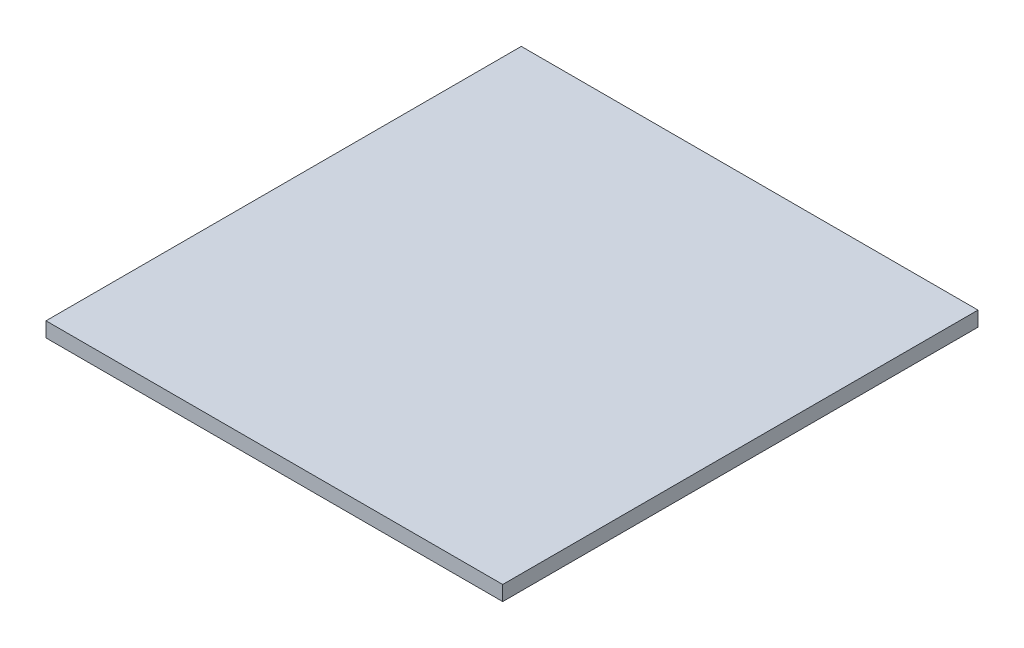
ISO-10303-21;
HEADER;
FILE_DESCRIPTION(('STEP AP214'),'2;1');
FILE_NAME('part.step','',(''),(''),'','','');
FILE_SCHEMA(('AUTOMOTIVE_DESIGN { 1 0 10303 214 1 1 1 1 }'));
ENDSEC;
DATA;
#1=APPLICATION_CONTEXT('core data for automotive mechanical design processes');
#2=APPLICATION_PROTOCOL_DEFINITION('international standard','automotive_design',2000,#1);
#3=PRODUCT_CONTEXT('',#1,'mechanical');
#4=PRODUCT('Part','Part','',(#3));
#5=PRODUCT_RELATED_PRODUCT_CATEGORY('part','',(#4));
#6=PRODUCT_DEFINITION_FORMATION('','',#4);
#7=PRODUCT_DEFINITION_CONTEXT('part definition',#1,'design');
#8=PRODUCT_DEFINITION('design','',#6,#7);
#9=PRODUCT_DEFINITION_SHAPE('','',#8);
#10=(LENGTH_UNIT() NAMED_UNIT(*) SI_UNIT(.MILLI.,.METRE.));
#11=(NAMED_UNIT(*) PLANE_ANGLE_UNIT() SI_UNIT($,.RADIAN.));
#12=(NAMED_UNIT(*) SI_UNIT($,.STERADIAN.) SOLID_ANGLE_UNIT());
#13=UNCERTAINTY_MEASURE_WITH_UNIT(LENGTH_MEASURE(1.E-05),#10,'distance_accuracy_value','');
#14=(GEOMETRIC_REPRESENTATION_CONTEXT(3) GLOBAL_UNCERTAINTY_ASSIGNED_CONTEXT((#13)) GLOBAL_UNIT_ASSIGNED_CONTEXT((#10,
#11,#12)) REPRESENTATION_CONTEXT('',''));
#15=CARTESIAN_POINT('',(0.,0.,0.));
#16=DIRECTION('',(0.,0.,1.));
#17=DIRECTION('',(1.,0.,0.));
#18=AXIS2_PLACEMENT_3D('',#15,#16,#17);
#19=CARTESIAN_POINT('',(390.525,12.7,-406.4));
#20=DIRECTION('',(-1.,0.,0.));
#21=DIRECTION('',(0.,0.,1.));
#22=AXIS2_PLACEMENT_3D('',#19,#20,#21);
#23=PLANE('',#22);
#24=DIRECTION('',(0.,0.,-1.));
#25=VECTOR('',#24,1.);
#26=CARTESIAN_POINT('',(390.525,0.,-406.4));
#27=LINE('',#26,#25);
#28=CARTESIAN_POINT('',(390.525,0.,0.));
#29=VERTEX_POINT('',#28);
#30=CARTESIAN_POINT('',(390.525,0.,-406.4));
#31=VERTEX_POINT('',#30);
#32=EDGE_CURVE('E96',#29,#31,#27,.T.);
#33=ORIENTED_EDGE('',*,*,#32,.T.);
#34=DIRECTION('',(0.,-1.,0.));
#35=VECTOR('',#34,1.);
#36=CARTESIAN_POINT('',(390.525,12.7,-406.4));
#37=LINE('',#36,#35);
#38=CARTESIAN_POINT('',(390.525,12.7,-406.4));
#39=VERTEX_POINT('',#38);
#40=EDGE_CURVE('E11',#39,#31,#37,.T.);
#41=ORIENTED_EDGE('',*,*,#40,.F.);
#42=DIRECTION('',(0.,0.,-1.));
#43=VECTOR('',#42,1.);
#44=CARTESIAN_POINT('',(390.525,12.7,-406.4));
#45=LINE('',#44,#43);
#46=CARTESIAN_POINT('',(390.525,12.7,0.));
#47=VERTEX_POINT('',#46);
#48=EDGE_CURVE('E84',#47,#39,#45,.T.);
#49=ORIENTED_EDGE('',*,*,#48,.F.);
#50=DIRECTION('',(0.,-1.,0.));
#51=VECTOR('',#50,1.);
#52=CARTESIAN_POINT('',(390.525,12.7,0.));
#53=LINE('',#52,#51);
#54=EDGE_CURVE('E92',#47,#29,#53,.T.);
#55=ORIENTED_EDGE('',*,*,#54,.T.);
#56=EDGE_LOOP('',(#33,#41,#49,#55));
#57=FACE_BOUND('',#56,.T.);
#58=ADVANCED_FACE('F33',(#57),#23,.F.);
#59=CARTESIAN_POINT('',(0.,12.7,-406.4));
#60=DIRECTION('',(0.,0.,1.));
#61=DIRECTION('',(1.,0.,0.));
#62=AXIS2_PLACEMENT_3D('',#59,#60,#61);
#63=PLANE('',#62);
#64=DIRECTION('',(-1.,0.,0.));
#65=VECTOR('',#64,1.);
#66=CARTESIAN_POINT('',(0.,0.,-406.4));
#67=LINE('',#66,#65);
#68=CARTESIAN_POINT('',(0.,0.,-406.4));
#69=VERTEX_POINT('',#68);
#70=EDGE_CURVE('E88',#31,#69,#67,.T.);
#71=ORIENTED_EDGE('',*,*,#70,.T.);
#72=DIRECTION('',(0.,-1.,0.));
#73=VECTOR('',#72,1.);
#74=CARTESIAN_POINT('',(0.,12.7,-406.4));
#75=LINE('',#74,#73);
#76=CARTESIAN_POINT('',(0.,12.7,-406.4));
#77=VERTEX_POINT('',#76);
#78=EDGE_CURVE('E41',#77,#69,#75,.T.);
#79=ORIENTED_EDGE('',*,*,#78,.F.);
#80=DIRECTION('',(-1.,0.,0.));
#81=VECTOR('',#80,1.);
#82=CARTESIAN_POINT('',(0.,12.7,-406.4));
#83=LINE('',#82,#81);
#84=EDGE_CURVE('E79',#39,#77,#83,.T.);
#85=ORIENTED_EDGE('',*,*,#84,.F.);
#86=ORIENTED_EDGE('',*,*,#40,.T.);
#87=EDGE_LOOP('',(#71,#79,#85,#86));
#88=FACE_BOUND('',#87,.T.);
#89=ADVANCED_FACE('F87',(#88),#63,.F.);
#90=CARTESIAN_POINT('',(0.,12.7,-406.4));
#91=DIRECTION('',(1.,0.,0.));
#92=DIRECTION('',(0.,0.,-1.));
#93=AXIS2_PLACEMENT_3D('',#90,#91,#92);
#94=PLANE('',#93);
#95=DIRECTION('',(0.,0.,1.));
#96=VECTOR('',#95,1.);
#97=CARTESIAN_POINT('',(0.,0.,-406.4));
#98=LINE('',#97,#96);
#99=CARTESIAN_POINT('',(0.,0.,0.));
#100=VERTEX_POINT('',#99);
#101=EDGE_CURVE('E66',#69,#100,#98,.T.);
#102=ORIENTED_EDGE('',*,*,#101,.T.);
#103=DIRECTION('',(0.,-1.,0.));
#104=VECTOR('',#103,1.);
#105=CARTESIAN_POINT('',(0.,12.7,0.));
#106=LINE('',#105,#104);
#107=CARTESIAN_POINT('',(0.,12.7,0.));
#108=VERTEX_POINT('',#107);
#109=EDGE_CURVE('E89',#108,#100,#106,.T.);
#110=ORIENTED_EDGE('',*,*,#109,.F.);
#111=DIRECTION('',(0.,0.,1.));
#112=VECTOR('',#111,1.);
#113=CARTESIAN_POINT('',(0.,12.7,-406.4));
#114=LINE('',#113,#112);
#115=EDGE_CURVE('E82',#77,#108,#114,.T.);
#116=ORIENTED_EDGE('',*,*,#115,.F.);
#117=ORIENTED_EDGE('',*,*,#78,.T.);
#118=EDGE_LOOP('',(#102,#110,#116,#117));
#119=FACE_BOUND('',#118,.T.);
#120=ADVANCED_FACE('F90',(#119),#94,.F.);
#121=CARTESIAN_POINT('',(0.,12.7,0.));
#122=DIRECTION('',(0.,0.,-1.));
#123=DIRECTION('',(-1.,0.,0.));
#124=AXIS2_PLACEMENT_3D('',#121,#122,#123);
#125=PLANE('',#124);
#126=DIRECTION('',(1.,0.,0.));
#127=VECTOR('',#126,1.);
#128=CARTESIAN_POINT('',(0.,0.,0.));
#129=LINE('',#128,#127);
#130=EDGE_CURVE('E72',#100,#29,#129,.T.);
#131=ORIENTED_EDGE('',*,*,#130,.T.);
#132=ORIENTED_EDGE('',*,*,#54,.F.);
#133=DIRECTION('',(1.,0.,0.));
#134=VECTOR('',#133,1.);
#135=CARTESIAN_POINT('',(0.,12.7,0.));
#136=LINE('',#135,#134);
#137=EDGE_CURVE('E49',#108,#47,#136,.T.);
#138=ORIENTED_EDGE('',*,*,#137,.F.);
#139=ORIENTED_EDGE('',*,*,#109,.T.);
#140=EDGE_LOOP('',(#131,#132,#138,#139));
#141=FACE_BOUND('',#140,.T.);
#142=ADVANCED_FACE('F103',(#141),#125,.F.);
#143=CARTESIAN_POINT('',(0.,12.7,0.));
#144=DIRECTION('',(0.,1.,0.));
#145=DIRECTION('',(0.,0.,1.));
#146=AXIS2_PLACEMENT_3D('',#143,#144,#145);
#147=PLANE('',#146);
#148=ORIENTED_EDGE('',*,*,#48,.T.);
#149=ORIENTED_EDGE('',*,*,#84,.T.);
#150=ORIENTED_EDGE('',*,*,#115,.T.);
#151=ORIENTED_EDGE('',*,*,#137,.T.);
#152=EDGE_LOOP('',(#148,#149,#150,#151));
#153=FACE_BOUND('',#152,.T.);
#154=ADVANCED_FACE('F80',(#153),#147,.T.);
#155=CARTESIAN_POINT('',(0.,0.,0.));
#156=DIRECTION('',(0.,1.,0.));
#157=DIRECTION('',(0.,0.,1.));
#158=AXIS2_PLACEMENT_3D('',#155,#156,#157);
#159=PLANE('',#158);
#160=ORIENTED_EDGE('',*,*,#32,.F.);
#161=ORIENTED_EDGE('',*,*,#130,.F.);
#162=ORIENTED_EDGE('',*,*,#101,.F.);
#163=ORIENTED_EDGE('',*,*,#70,.F.);
#164=EDGE_LOOP('',(#160,#161,#162,#163));
#165=FACE_BOUND('',#164,.T.);
#166=ADVANCED_FACE('F106',(#165),#159,.F.);
#167=CLOSED_SHELL('',(#58,#89,#120,#142,#154,#166));
#168=MANIFOLD_SOLID_BREP('B2',#167);
#169=ADVANCED_BREP_SHAPE_REPRESENTATION('',(#18,#168),#14);
#170=SHAPE_DEFINITION_REPRESENTATION(#9,#169);
ENDSEC;
END-ISO-10303-21;
